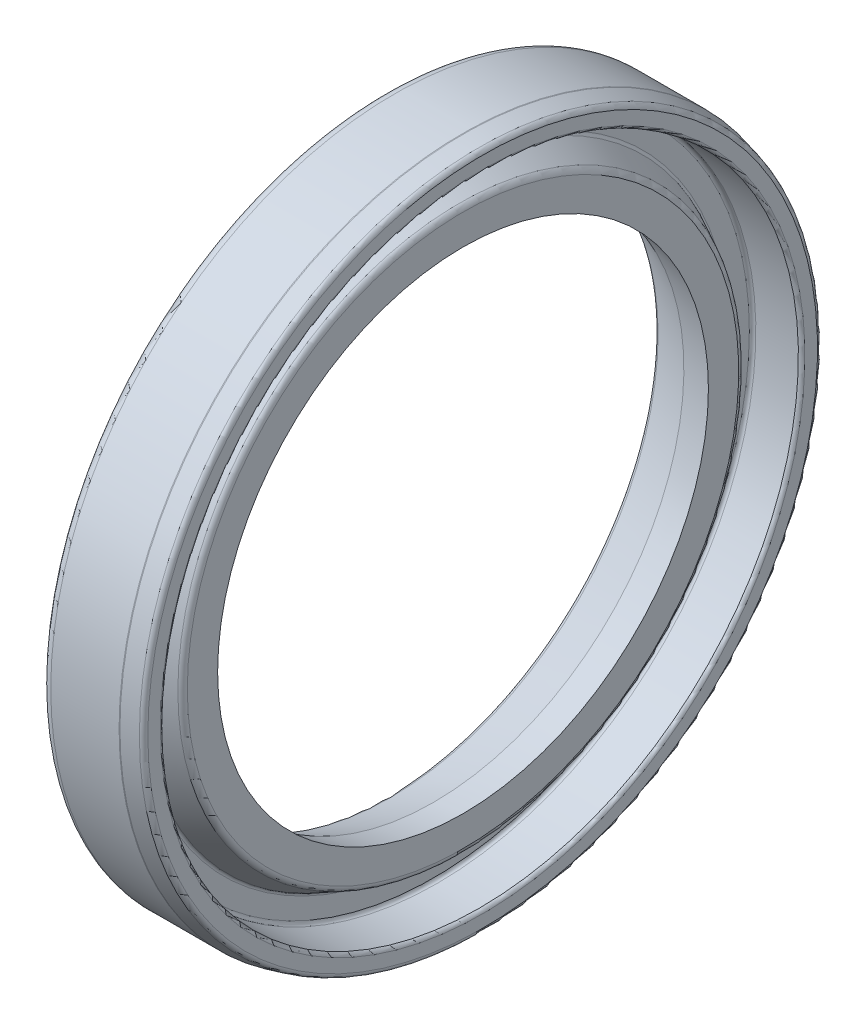
ISO-10303-21;
HEADER;
FILE_DESCRIPTION(('STEP AP214'),'2;1');
FILE_NAME('part.step','',(''),(''),'','','');
FILE_SCHEMA(('AUTOMOTIVE_DESIGN { 1 0 10303 214 1 1 1 1 }'));
ENDSEC;
DATA;
#1=APPLICATION_CONTEXT('core data for automotive mechanical design processes');
#2=APPLICATION_PROTOCOL_DEFINITION('international standard','automotive_design',2000,#1);
#3=PRODUCT_CONTEXT('',#1,'mechanical');
#4=PRODUCT('Part','Part','',(#3));
#5=PRODUCT_RELATED_PRODUCT_CATEGORY('part','',(#4));
#6=PRODUCT_DEFINITION_FORMATION('','',#4);
#7=PRODUCT_DEFINITION_CONTEXT('part definition',#1,'design');
#8=PRODUCT_DEFINITION('design','',#6,#7);
#9=PRODUCT_DEFINITION_SHAPE('','',#8);
#10=(LENGTH_UNIT() NAMED_UNIT(*) SI_UNIT(.MILLI.,.METRE.));
#11=(NAMED_UNIT(*) PLANE_ANGLE_UNIT() SI_UNIT($,.RADIAN.));
#12=(NAMED_UNIT(*) SI_UNIT($,.STERADIAN.) SOLID_ANGLE_UNIT());
#13=UNCERTAINTY_MEASURE_WITH_UNIT(LENGTH_MEASURE(1.E-05),#10,'distance_accuracy_value','');
#14=(GEOMETRIC_REPRESENTATION_CONTEXT(3) GLOBAL_UNCERTAINTY_ASSIGNED_CONTEXT((#13)) GLOBAL_UNIT_ASSIGNED_CONTEXT((#10,
#11,#12)) REPRESENTATION_CONTEXT('',''));
#15=CARTESIAN_POINT('',(0.,0.,0.));
#16=DIRECTION('',(0.,0.,1.));
#17=DIRECTION('',(1.,0.,0.));
#18=AXIS2_PLACEMENT_3D('',#15,#16,#17);
#19=CARTESIAN_POINT('',(0.,10.2,0.));
#20=DIRECTION('',(-1.,0.,0.));
#21=DIRECTION('',(0.,0.,1.));
#22=AXIS2_PLACEMENT_3D('',#19,#20,#21);
#23=PLANE('',#22);
#24=CARTESIAN_POINT('',(0.,0.,0.));
#25=DIRECTION('',(1.,0.,0.));
#26=DIRECTION('',(0.,0.,-1.));
#27=AXIS2_PLACEMENT_3D('',#24,#25,#26);
#28=CIRCLE('',#27,8.4531098884281);
#29=CARTESIAN_POINT('',(0.,0.,8.4531098884281));
#30=VERTEX_POINT('',#29);
#31=EDGE_CURVE('E28',#30,#30,#28,.T.);
#32=ORIENTED_EDGE('',*,*,#31,.T.);
#33=EDGE_LOOP('',(#32));
#34=FACE_BOUND('',#33,.T.);
#35=CARTESIAN_POINT('',(0.,0.,0.));
#36=DIRECTION('',(1.,0.,0.));
#37=DIRECTION('',(0.,0.,-1.));
#38=AXIS2_PLACEMENT_3D('',#35,#36,#37);
#39=CIRCLE('',#38,10.2);
#40=CARTESIAN_POINT('',(0.,0.,10.2));
#41=VERTEX_POINT('',#40);
#42=EDGE_CURVE('E208',#41,#41,#39,.T.);
#43=ORIENTED_EDGE('',*,*,#42,.F.);
#44=EDGE_LOOP('',(#43));
#45=FACE_BOUND('',#44,.T.);
#46=ADVANCED_FACE('F17',(#34,#45),#23,.T.);
#47=CARTESIAN_POINT('',(0.299999999999938,0.,0.));
#48=DIRECTION('',(1.,0.,0.));
#49=DIRECTION('',(0.,0.,-1.));
#50=AXIS2_PLACEMENT_3D('',#47,#48,#49);
#51=TOROIDAL_SURFACE('',#50,8.45310988842804,0.299999999999938);
#52=ORIENTED_EDGE('',*,*,#31,.F.);
#53=CARTESIAN_POINT('',(0.299999999999938,0.,8.45310988842804));
#54=DIRECTION('',(0.,-1.,0.));
#55=DIRECTION('',(0.,0.,1.));
#56=AXIS2_PLACEMENT_3D('',#53,#54,#55);
#57=CIRCLE('',#56,0.299999999999938);
#58=CARTESIAN_POINT('',(0.18858279709377,0.,8.1745668811625));
#59=VERTEX_POINT('',#58);
#60=EDGE_CURVE('E11',#30,#59,#57,.T.);
#61=ORIENTED_EDGE('',*,*,#60,.T.);
#62=CARTESIAN_POINT('',(0.18858279709377,0.,0.));
#63=DIRECTION('',(1.,0.,0.));
#64=DIRECTION('',(0.,0.,-1.));
#65=AXIS2_PLACEMENT_3D('',#62,#63,#64);
#66=CIRCLE('',#65,8.1745668811625);
#67=CARTESIAN_POINT('',(0.18858279709377,-8.1745668811625,0.));
#68=VERTEX_POINT('',#67);
#69=EDGE_CURVE('E218',#59,#68,#66,.T.);
#70=ORIENTED_EDGE('',*,*,#69,.T.);
#71=CARTESIAN_POINT('',(0.18858279709377,0.,0.));
#72=DIRECTION('',(1.,0.,0.));
#73=DIRECTION('',(0.,0.,-1.));
#74=AXIS2_PLACEMENT_3D('',#71,#72,#73);
#75=CIRCLE('',#74,8.1745668811625);
#76=EDGE_CURVE('E162',#68,#59,#75,.T.);
#77=ORIENTED_EDGE('',*,*,#76,.T.);
#78=ORIENTED_EDGE('',*,*,#60,.F.);
#79=EDGE_LOOP('',(#52,#61,#70,#77,#78));
#80=FACE_BOUND('',#79,.T.);
#81=ADVANCED_FACE('F334',(#80),#51,.T.);
#82=CARTESIAN_POINT('',(0.844291398546885,0.,0.));
#83=DIRECTION('',(-1.,0.,0.));
#84=DIRECTION('',(0.,1.,0.));
#85=AXIS2_PLACEMENT_3D('',#82,#83,#84);
#86=CONICAL_SURFACE('',#85,7.91228344058125,0.38050637711237);
#87=CARTESIAN_POINT('',(1.5,0.,0.));
#88=DIRECTION('',(1.,0.,0.));
#89=DIRECTION('',(0.,0.,-1.));
#90=AXIS2_PLACEMENT_3D('',#87,#88,#89);
#91=CIRCLE('',#90,7.65);
#92=CARTESIAN_POINT('',(1.5,-7.65,0.));
#93=VERTEX_POINT('',#92);
#94=EDGE_CURVE('E228',#93,#93,#91,.T.);
#95=ORIENTED_EDGE('',*,*,#94,.T.);
#96=DIRECTION('',(-0.928476690885258,-0.371390676354108,0.));
#97=VECTOR('',#96,1.);
#98=CARTESIAN_POINT('',(0.844291398546885,-7.91228344058125,0.));
#99=LINE('',#98,#97);
#100=EDGE_CURVE('E235',#93,#68,#99,.T.);
#101=ORIENTED_EDGE('',*,*,#100,.T.);
#102=ORIENTED_EDGE('',*,*,#69,.F.);
#103=ORIENTED_EDGE('',*,*,#76,.F.);
#104=ORIENTED_EDGE('',*,*,#100,.F.);
#105=EDGE_LOOP('',(#95,#101,#102,#103,#104));
#106=FACE_BOUND('',#105,.T.);
#107=ADVANCED_FACE('F342',(#106),#86,.F.);
#108=CARTESIAN_POINT('',(1.95,0.,0.));
#109=DIRECTION('',(-1.,0.,0.));
#110=DIRECTION('',(0.,1.,0.));
#111=AXIS2_PLACEMENT_3D('',#108,#109,#110);
#112=CONICAL_SURFACE('',#111,7.575,0.165148677414628);
#113=CARTESIAN_POINT('',(2.4,0.,0.));
#114=DIRECTION('',(1.,0.,0.));
#115=DIRECTION('',(0.,0.,-1.));
#116=AXIS2_PLACEMENT_3D('',#113,#114,#115);
#117=CIRCLE('',#116,7.5);
#118=CARTESIAN_POINT('',(2.4,-7.5,0.));
#119=VERTEX_POINT('',#118);
#120=EDGE_CURVE('E134',#119,#119,#117,.T.);
#121=ORIENTED_EDGE('',*,*,#120,.T.);
#122=DIRECTION('',(-0.986393923832143,-0.164398987305359,0.));
#123=VECTOR('',#122,1.);
#124=CARTESIAN_POINT('',(1.95,-7.575,0.));
#125=LINE('',#124,#123);
#126=EDGE_CURVE('E221',#119,#93,#125,.T.);
#127=ORIENTED_EDGE('',*,*,#126,.T.);
#128=ORIENTED_EDGE('',*,*,#94,.F.);
#129=ORIENTED_EDGE('',*,*,#126,.F.);
#130=EDGE_LOOP('',(#121,#127,#128,#129));
#131=FACE_BOUND('',#130,.T.);
#132=ADVANCED_FACE('F362',(#131),#112,.F.);
#133=CARTESIAN_POINT('',(2.4,7.5,0.));
#134=DIRECTION('',(1.,0.,0.));
#135=DIRECTION('',(0.,1.,0.));
#136=AXIS2_PLACEMENT_3D('',#133,#134,#135);
#137=PLANE('',#136);
#138=ORIENTED_EDGE('',*,*,#120,.F.);
#139=EDGE_LOOP('',(#138));
#140=FACE_BOUND('',#139,.T.);
#141=CARTESIAN_POINT('',(2.4,0.,0.));
#142=DIRECTION('',(1.,0.,0.));
#143=DIRECTION('',(0.,0.,-1.));
#144=AXIS2_PLACEMENT_3D('',#141,#142,#143);
#145=CIRCLE('',#144,8.42639320225);
#146=CARTESIAN_POINT('',(2.4,0.,8.42639320225));
#147=VERTEX_POINT('',#146);
#148=EDGE_CURVE('E21',#147,#147,#145,.T.);
#149=ORIENTED_EDGE('',*,*,#148,.T.);
#150=EDGE_LOOP('',(#149));
#151=FACE_BOUND('',#150,.T.);
#152=ADVANCED_FACE('F137',(#140,#151),#137,.T.);
#153=CARTESIAN_POINT('',(2.19999999999982,0.,0.));
#154=DIRECTION('',(1.,0.,0.));
#155=DIRECTION('',(0.,0.,-1.));
#156=AXIS2_PLACEMENT_3D('',#153,#154,#155);
#157=TOROIDAL_SURFACE('',#156,8.42639320224991,0.200000000000184);
#158=ORIENTED_EDGE('',*,*,#148,.F.);
#159=CARTESIAN_POINT('',(2.19999999999982,0.,8.42639320224991));
#160=DIRECTION('',(0.,-1.,0.));
#161=DIRECTION('',(0.,0.,1.));
#162=AXIS2_PLACEMENT_3D('',#159,#160,#161);
#163=CIRCLE('',#162,0.200000000000184);
#164=CARTESIAN_POINT('',(2.2894427191,0.,8.60527864045));
#165=VERTEX_POINT('',#164);
#166=EDGE_CURVE('E127',#147,#165,#163,.T.);
#167=ORIENTED_EDGE('',*,*,#166,.T.);
#168=CARTESIAN_POINT('',(2.2894427191,0.,0.));
#169=DIRECTION('',(1.,0.,0.));
#170=DIRECTION('',(0.,0.,-1.));
#171=AXIS2_PLACEMENT_3D('',#168,#169,#170);
#172=CIRCLE('',#171,8.60527864045);
#173=CARTESIAN_POINT('',(2.2894427191,-8.60527864045,0.));
#174=VERTEX_POINT('',#173);
#175=EDGE_CURVE('E139',#165,#174,#172,.T.);
#176=ORIENTED_EDGE('',*,*,#175,.T.);
#177=CARTESIAN_POINT('',(2.2894427191,0.,0.));
#178=DIRECTION('',(1.,0.,0.));
#179=DIRECTION('',(0.,0.,-1.));
#180=AXIS2_PLACEMENT_3D('',#177,#178,#179);
#181=CIRCLE('',#180,8.60527864045);
#182=EDGE_CURVE('E131',#174,#165,#181,.T.);
#183=ORIENTED_EDGE('',*,*,#182,.T.);
#184=ORIENTED_EDGE('',*,*,#166,.F.);
#185=EDGE_LOOP('',(#158,#167,#176,#183,#184));
#186=FACE_BOUND('',#185,.T.);
#187=ADVANCED_FACE('F129',(#186),#157,.T.);
#188=CARTESIAN_POINT('',(1.922360679775,0.,0.));
#189=DIRECTION('',(-1.,0.,0.));
#190=DIRECTION('',(0.,1.,0.));
#191=AXIS2_PLACEMENT_3D('',#188,#189,#190);
#192=CONICAL_SURFACE('',#191,8.7888196601125,0.463647609000806);
#193=ORIENTED_EDGE('',*,*,#182,.F.);
#194=DIRECTION('',(-0.894427190999916,-0.447213595499958,0.));
#195=VECTOR('',#194,1.);
#196=CARTESIAN_POINT('',(1.922360679775,-8.7888196601125,0.));
#197=LINE('',#196,#195);
#198=CARTESIAN_POINT('',(1.55527864045,-8.972360679775,0.));
#199=VERTEX_POINT('',#198);
#200=EDGE_CURVE('E144',#174,#199,#197,.T.);
#201=ORIENTED_EDGE('',*,*,#200,.T.);
#202=CARTESIAN_POINT('',(1.55527864045,0.,0.));
#203=DIRECTION('',(1.,0.,0.));
#204=DIRECTION('',(0.,0.,-1.));
#205=AXIS2_PLACEMENT_3D('',#202,#203,#204);
#206=CIRCLE('',#205,8.972360679775);
#207=CARTESIAN_POINT('',(1.55527864045,0.,8.972360679775));
#208=VERTEX_POINT('',#207);
#209=EDGE_CURVE('E215',#199,#208,#206,.T.);
#210=ORIENTED_EDGE('',*,*,#209,.T.);
#211=CARTESIAN_POINT('',(1.55527864045,0.,0.));
#212=DIRECTION('',(1.,0.,0.));
#213=DIRECTION('',(0.,0.,-1.));
#214=AXIS2_PLACEMENT_3D('',#211,#212,#213);
#215=CIRCLE('',#214,8.972360679775);
#216=EDGE_CURVE('E153',#208,#199,#215,.T.);
#217=ORIENTED_EDGE('',*,*,#216,.T.);
#218=ORIENTED_EDGE('',*,*,#200,.F.);
#219=ORIENTED_EDGE('',*,*,#175,.F.);
#220=EDGE_LOOP('',(#193,#201,#210,#217,#218,#219));
#221=FACE_BOUND('',#220,.T.);
#222=ADVANCED_FACE('F309',(#221),#192,.T.);
#223=CARTESIAN_POINT('',(1.60000000000009,0.,0.));
#224=DIRECTION('',(1.,0.,0.));
#225=DIRECTION('',(0.,0.,-1.));
#226=AXIS2_PLACEMENT_3D('',#223,#224,#225);
#227=TOROIDAL_SURFACE('',#226,9.06180339887504,0.100000000000084);
#228=CARTESIAN_POINT('',(1.5,0.,0.));
#229=DIRECTION('',(1.,0.,0.));
#230=DIRECTION('',(0.,0.,-1.));
#231=AXIS2_PLACEMENT_3D('',#228,#229,#230);
#232=CIRCLE('',#231,9.061803398875);
#233=CARTESIAN_POINT('',(1.5,0.,9.061803398875));
#234=VERTEX_POINT('',#233);
#235=EDGE_CURVE('E169',#234,#234,#232,.T.);
#236=ORIENTED_EDGE('',*,*,#235,.T.);
#237=CARTESIAN_POINT('',(1.60000000000009,0.,9.06180339887504));
#238=DIRECTION('',(0.,-1.,0.));
#239=DIRECTION('',(0.,0.,1.));
#240=AXIS2_PLACEMENT_3D('',#237,#238,#239);
#241=CIRCLE('',#240,0.100000000000084);
#242=EDGE_CURVE('E173',#234,#208,#241,.T.);
#243=ORIENTED_EDGE('',*,*,#242,.T.);
#244=ORIENTED_EDGE('',*,*,#209,.F.);
#245=ORIENTED_EDGE('',*,*,#216,.F.);
#246=ORIENTED_EDGE('',*,*,#242,.F.);
#247=EDGE_LOOP('',(#236,#243,#244,#245,#246));
#248=FACE_BOUND('',#247,.T.);
#249=ADVANCED_FACE('F312',(#248),#227,.F.);
#250=CARTESIAN_POINT('',(1.5,9.061803398875,0.));
#251=DIRECTION('',(1.,0.,0.));
#252=DIRECTION('',(0.,1.,0.));
#253=AXIS2_PLACEMENT_3D('',#250,#251,#252);
#254=PLANE('',#253);
#255=ORIENTED_EDGE('',*,*,#235,.F.);
#256=EDGE_LOOP('',(#255));
#257=FACE_BOUND('',#256,.T.);
#258=CARTESIAN_POINT('',(1.5,0.,0.));
#259=DIRECTION('',(1.,0.,0.));
#260=DIRECTION('',(0.,0.,-1.));
#261=AXIS2_PLACEMENT_3D('',#258,#259,#260);
#262=CIRCLE('',#261,9.65);
#263=CARTESIAN_POINT('',(1.5,0.,9.65));
#264=VERTEX_POINT('',#263);
#265=EDGE_CURVE('E167',#264,#264,#262,.T.);
#266=ORIENTED_EDGE('',*,*,#265,.T.);
#267=EDGE_LOOP('',(#266));
#268=FACE_BOUND('',#267,.T.);
#269=ADVANCED_FACE('F348',(#257,#268),#254,.T.);
#270=CARTESIAN_POINT('',(1.59999999999985,0.,0.));
#271=DIRECTION('',(1.,0.,0.));
#272=DIRECTION('',(0.,0.,-1.));
#273=AXIS2_PLACEMENT_3D('',#270,#271,#272);
#274=TOROIDAL_SURFACE('',#273,9.65000000000015,0.099999999999846);
#275=CARTESIAN_POINT('',(1.6,0.,0.));
#276=DIRECTION('',(1.,0.,0.));
#277=DIRECTION('',(0.,0.,-1.));
#278=AXIS2_PLACEMENT_3D('',#275,#276,#277);
#279=CIRCLE('',#278,9.75);
#280=CARTESIAN_POINT('',(1.6,-9.75,0.));
#281=VERTEX_POINT('',#280);
#282=CARTESIAN_POINT('',(1.6,0.,9.75));
#283=VERTEX_POINT('',#282);
#284=EDGE_CURVE('E168',#281,#283,#279,.T.);
#285=ORIENTED_EDGE('',*,*,#284,.T.);
#286=CARTESIAN_POINT('',(1.59999999999985,0.,9.65000000000015));
#287=DIRECTION('',(0.,-1.,0.));
#288=DIRECTION('',(0.,0.,1.));
#289=AXIS2_PLACEMENT_3D('',#286,#287,#288);
#290=CIRCLE('',#289,0.099999999999846);
#291=EDGE_CURVE('E163',#283,#264,#290,.T.);
#292=ORIENTED_EDGE('',*,*,#291,.T.);
#293=ORIENTED_EDGE('',*,*,#265,.F.);
#294=ORIENTED_EDGE('',*,*,#291,.F.);
#295=CARTESIAN_POINT('',(1.6,0.,0.));
#296=DIRECTION('',(1.,0.,0.));
#297=DIRECTION('',(0.,0.,-1.));
#298=AXIS2_PLACEMENT_3D('',#295,#296,#297);
#299=CIRCLE('',#298,9.75);
#300=EDGE_CURVE('E194',#283,#281,#299,.T.);
#301=ORIENTED_EDGE('',*,*,#300,.T.);
#302=EDGE_LOOP('',(#285,#292,#293,#294,#301));
#303=FACE_BOUND('',#302,.T.);
#304=ADVANCED_FACE('F346',(#303),#274,.F.);
#305=CARTESIAN_POINT('',(2.25,0.,0.));
#306=DIRECTION('',(1.,0.,0.));
#307=DIRECTION('',(0.,1.,0.));
#308=AXIS2_PLACEMENT_3D('',#305,#306,#307);
#309=CYLINDRICAL_SURFACE('',#308,9.75);
#310=CARTESIAN_POINT('',(2.9,0.,0.));
#311=DIRECTION('',(1.,0.,0.));
#312=DIRECTION('',(0.,0.,-1.));
#313=AXIS2_PLACEMENT_3D('',#310,#311,#312);
#314=CIRCLE('',#313,9.75);
#315=CARTESIAN_POINT('',(2.9,-9.75,0.));
#316=VERTEX_POINT('',#315);
#317=CARTESIAN_POINT('',(2.9,0.,9.75));
#318=VERTEX_POINT('',#317);
#319=EDGE_CURVE('E178',#316,#318,#314,.T.);
#320=ORIENTED_EDGE('',*,*,#319,.T.);
#321=CARTESIAN_POINT('',(2.9,0.,0.));
#322=DIRECTION('',(1.,0.,0.));
#323=DIRECTION('',(0.,0.,-1.));
#324=AXIS2_PLACEMENT_3D('',#321,#322,#323);
#325=CIRCLE('',#324,9.75);
#326=EDGE_CURVE('E186',#318,#316,#325,.T.);
#327=ORIENTED_EDGE('',*,*,#326,.T.);
#328=DIRECTION('',(-1.,0.,0.));
#329=VECTOR('',#328,1.);
#330=CARTESIAN_POINT('',(2.25,-9.75,0.));
#331=LINE('',#330,#329);
#332=EDGE_CURVE('E185',#316,#281,#331,.T.);
#333=ORIENTED_EDGE('',*,*,#332,.T.);
#334=ORIENTED_EDGE('',*,*,#300,.F.);
#335=ORIENTED_EDGE('',*,*,#284,.F.);
#336=ORIENTED_EDGE('',*,*,#332,.F.);
#337=EDGE_LOOP('',(#320,#327,#333,#334,#335,#336));
#338=FACE_BOUND('',#337,.T.);
#339=ADVANCED_FACE('F404',(#338),#309,.F.);
#340=CARTESIAN_POINT('',(2.90000000000015,0.,0.));
#341=DIRECTION('',(1.,0.,0.));
#342=DIRECTION('',(0.,0.,-1.));
#343=AXIS2_PLACEMENT_3D('',#340,#341,#342);
#344=TOROIDAL_SURFACE('',#343,9.84999999999985,0.0999999999998469);
#345=ORIENTED_EDGE('',*,*,#319,.F.);
#346=ORIENTED_EDGE('',*,*,#326,.F.);
#347=CARTESIAN_POINT('',(2.90000000000015,0.,9.84999999999985));
#348=DIRECTION('',(0.,-1.,0.));
#349=DIRECTION('',(0.,0.,1.));
#350=AXIS2_PLACEMENT_3D('',#347,#348,#349);
#351=CIRCLE('',#350,0.0999999999998469);
#352=CARTESIAN_POINT('',(3.,0.,9.85));
#353=VERTEX_POINT('',#352);
#354=EDGE_CURVE('E183',#318,#353,#351,.T.);
#355=ORIENTED_EDGE('',*,*,#354,.T.);
#356=CARTESIAN_POINT('',(3.,0.,0.));
#357=DIRECTION('',(1.,0.,0.));
#358=DIRECTION('',(0.,0.,-1.));
#359=AXIS2_PLACEMENT_3D('',#356,#357,#358);
#360=CIRCLE('',#359,9.85);
#361=EDGE_CURVE('E174',#353,#353,#360,.T.);
#362=ORIENTED_EDGE('',*,*,#361,.T.);
#363=ORIENTED_EDGE('',*,*,#354,.F.);
#364=EDGE_LOOP('',(#345,#346,#355,#362,#363));
#365=FACE_BOUND('',#364,.T.);
#366=ADVANCED_FACE('F358',(#365),#344,.T.);
#367=CARTESIAN_POINT('',(3.,9.85,0.));
#368=DIRECTION('',(1.,0.,0.));
#369=DIRECTION('',(0.,1.,0.));
#370=AXIS2_PLACEMENT_3D('',#367,#368,#369);
#371=PLANE('',#370);
#372=ORIENTED_EDGE('',*,*,#361,.F.);
#373=EDGE_LOOP('',(#372));
#374=FACE_BOUND('',#373,.T.);
#375=CARTESIAN_POINT('',(3.,0.,0.));
#376=DIRECTION('',(1.,0.,0.));
#377=DIRECTION('',(0.,0.,-1.));
#378=AXIS2_PLACEMENT_3D('',#375,#376,#377);
#379=CIRCLE('',#378,10.232883539039);
#380=CARTESIAN_POINT('',(3.,0.,10.232883539039));
#381=VERTEX_POINT('',#380);
#382=EDGE_CURVE('E281',#381,#381,#379,.T.);
#383=ORIENTED_EDGE('',*,*,#382,.T.);
#384=EDGE_LOOP('',(#383));
#385=FACE_BOUND('',#384,.T.);
#386=ADVANCED_FACE('F354',(#374,#385),#371,.T.);
#387=CARTESIAN_POINT('',(2.8500000000009,0.,0.));
#388=DIRECTION('',(1.,0.,0.));
#389=DIRECTION('',(0.,0.,-1.));
#390=AXIS2_PLACEMENT_3D('',#387,#388,#389);
#391=TOROIDAL_SURFACE('',#390,10.2328835390399,0.149999999999096);
#392=ORIENTED_EDGE('',*,*,#382,.F.);
#393=CARTESIAN_POINT('',(2.8500000000009,0.,10.2328835390399));
#394=DIRECTION('',(0.,-1.,0.));
#395=DIRECTION('',(0.,0.,1.));
#396=AXIS2_PLACEMENT_3D('',#393,#394,#395);
#397=CIRCLE('',#396,0.149999999999096);
#398=CARTESIAN_POINT('',(2.8863803437554,0.,10.378404914061));
#399=VERTEX_POINT('',#398);
#400=EDGE_CURVE('E179',#381,#399,#397,.T.);
#401=ORIENTED_EDGE('',*,*,#400,.T.);
#402=CARTESIAN_POINT('',(2.8863803437554,0.,0.));
#403=DIRECTION('',(1.,0.,0.));
#404=DIRECTION('',(0.,0.,-1.));
#405=AXIS2_PLACEMENT_3D('',#402,#403,#404);
#406=CIRCLE('',#405,10.378404914061);
#407=CARTESIAN_POINT('',(2.8863803437554,-10.378404914061,0.));
#408=VERTEX_POINT('',#407);
#409=EDGE_CURVE('E272',#399,#408,#406,.T.);
#410=ORIENTED_EDGE('',*,*,#409,.T.);
#411=CARTESIAN_POINT('',(2.8863803437554,0.,0.));
#412=DIRECTION('',(1.,0.,0.));
#413=DIRECTION('',(0.,0.,-1.));
#414=AXIS2_PLACEMENT_3D('',#411,#412,#413);
#415=CIRCLE('',#414,10.378404914061);
#416=EDGE_CURVE('E254',#408,#399,#415,.T.);
#417=ORIENTED_EDGE('',*,*,#416,.T.);
#418=ORIENTED_EDGE('',*,*,#400,.F.);
#419=EDGE_LOOP('',(#392,#401,#410,#417,#418));
#420=FACE_BOUND('',#419,.T.);
#421=ADVANCED_FACE('F357',(#420),#391,.T.);
#422=CARTESIAN_POINT('',(2.64916167184865,0.,0.));
#423=DIRECTION('',(-1.,0.,0.));
#424=DIRECTION('',(0.,1.,0.));
#425=AXIS2_PLACEMENT_3D('',#422,#423,#424);
#426=CONICAL_SURFACE('',#425,10.437709582038,0.244978663128106);
#427=ORIENTED_EDGE('',*,*,#416,.F.);
#428=DIRECTION('',(-0.970142500145031,-0.242535625037537,0.));
#429=VECTOR('',#428,1.);
#430=CARTESIAN_POINT('',(2.64916167184865,-10.437709582038,0.));
#431=LINE('',#430,#429);
#432=CARTESIAN_POINT('',(2.4119429999419,-10.497014250015,0.));
#433=VERTEX_POINT('',#432);
#434=EDGE_CURVE('E264',#408,#433,#431,.T.);
#435=ORIENTED_EDGE('',*,*,#434,.T.);
#436=CARTESIAN_POINT('',(2.4119429999419,0.,0.));
#437=DIRECTION('',(1.,0.,0.));
#438=DIRECTION('',(0.,0.,-1.));
#439=AXIS2_PLACEMENT_3D('',#436,#437,#438);
#440=CIRCLE('',#439,10.497014250015);
#441=CARTESIAN_POINT('',(2.4119429999419,0.,10.497014250015));
#442=VERTEX_POINT('',#441);
#443=EDGE_CURVE('E241',#433,#442,#440,.T.);
#444=ORIENTED_EDGE('',*,*,#443,.T.);
#445=CARTESIAN_POINT('',(2.4119429999419,0.,0.));
#446=DIRECTION('',(1.,0.,0.));
#447=DIRECTION('',(0.,0.,-1.));
#448=AXIS2_PLACEMENT_3D('',#445,#446,#447);
#449=CIRCLE('',#448,10.497014250015);
#450=EDGE_CURVE('E255',#442,#433,#449,.T.);
#451=ORIENTED_EDGE('',*,*,#450,.T.);
#452=ORIENTED_EDGE('',*,*,#434,.F.);
#453=ORIENTED_EDGE('',*,*,#409,.F.);
#454=EDGE_LOOP('',(#427,#435,#444,#451,#452,#453));
#455=FACE_BOUND('',#454,.T.);
#456=ADVANCED_FACE('F19',(#455),#426,.T.);
#457=CARTESIAN_POINT('',(2.38768943743161,0.,0.));
#458=DIRECTION('',(1.,0.,0.));
#459=DIRECTION('',(0.,0.,-1.));
#460=AXIS2_PLACEMENT_3D('',#457,#458,#459);
#461=TOROIDAL_SURFACE('',#460,10.3999999999307,0.100000000069256);
#462=ORIENTED_EDGE('',*,*,#443,.F.);
#463=ORIENTED_EDGE('',*,*,#450,.F.);
#464=CARTESIAN_POINT('',(2.38768943743161,0.,10.3999999999307));
#465=DIRECTION('',(0.,-1.,0.));
#466=DIRECTION('',(0.,0.,1.));
#467=AXIS2_PLACEMENT_3D('',#464,#465,#466);
#468=CIRCLE('',#467,0.100000000069256);
#469=CARTESIAN_POINT('',(2.3876894374382,0.,10.5));
#470=VERTEX_POINT('',#469);
#471=EDGE_CURVE('E251',#442,#470,#468,.T.);
#472=ORIENTED_EDGE('',*,*,#471,.T.);
#473=CARTESIAN_POINT('',(2.3876894374382,0.,0.));
#474=DIRECTION('',(1.,0.,0.));
#475=DIRECTION('',(0.,0.,-1.));
#476=AXIS2_PLACEMENT_3D('',#473,#474,#475);
#477=CIRCLE('',#476,10.5);
#478=CARTESIAN_POINT('',(2.3876894374382,-10.5,0.));
#479=VERTEX_POINT('',#478);
#480=EDGE_CURVE('E238',#470,#479,#477,.T.);
#481=ORIENTED_EDGE('',*,*,#480,.T.);
#482=CARTESIAN_POINT('',(2.3876894374382,0.,0.));
#483=DIRECTION('',(1.,0.,0.));
#484=DIRECTION('',(0.,0.,-1.));
#485=AXIS2_PLACEMENT_3D('',#482,#483,#484);
#486=CIRCLE('',#485,10.5);
#487=EDGE_CURVE('E212',#479,#470,#486,.T.);
#488=ORIENTED_EDGE('',*,*,#487,.T.);
#489=ORIENTED_EDGE('',*,*,#471,.F.);
#490=EDGE_LOOP('',(#462,#463,#472,#481,#488,#489));
#491=FACE_BOUND('',#490,.T.);
#492=ADVANCED_FACE('F436',(#491),#461,.T.);
#493=CARTESIAN_POINT('',(1.3438447187191,0.,0.));
#494=DIRECTION('',(1.,0.,0.));
#495=DIRECTION('',(0.,1.,0.));
#496=AXIS2_PLACEMENT_3D('',#493,#494,#495);
#497=CYLINDRICAL_SURFACE('',#496,10.5);
#498=ORIENTED_EDGE('',*,*,#487,.F.);
#499=DIRECTION('',(-1.,0.,0.));
#500=VECTOR('',#499,1.);
#501=CARTESIAN_POINT('',(1.3438447187191,-10.5,0.));
#502=LINE('',#501,#500);
#503=CARTESIAN_POINT('',(0.3,-10.5,0.));
#504=VERTEX_POINT('',#503);
#505=EDGE_CURVE('E242',#479,#504,#502,.T.);
#506=ORIENTED_EDGE('',*,*,#505,.T.);
#507=CARTESIAN_POINT('',(0.3,0.,0.));
#508=DIRECTION('',(1.,0.,0.));
#509=DIRECTION('',(0.,0.,-1.));
#510=AXIS2_PLACEMENT_3D('',#507,#508,#509);
#511=CIRCLE('',#510,10.5);
#512=CARTESIAN_POINT('',(0.3,0.,10.5));
#513=VERTEX_POINT('',#512);
#514=EDGE_CURVE('E155',#504,#513,#511,.T.);
#515=ORIENTED_EDGE('',*,*,#514,.T.);
#516=CARTESIAN_POINT('',(0.3,0.,0.));
#517=DIRECTION('',(1.,0.,0.));
#518=DIRECTION('',(0.,0.,-1.));
#519=AXIS2_PLACEMENT_3D('',#516,#517,#518);
#520=CIRCLE('',#519,10.5);
#521=EDGE_CURVE('E159',#513,#504,#520,.T.);
#522=ORIENTED_EDGE('',*,*,#521,.T.);
#523=ORIENTED_EDGE('',*,*,#505,.F.);
#524=ORIENTED_EDGE('',*,*,#480,.F.);
#525=EDGE_LOOP('',(#498,#506,#515,#522,#523,#524));
#526=FACE_BOUND('',#525,.T.);
#527=ADVANCED_FACE('F443',(#526),#497,.T.);
#528=CARTESIAN_POINT('',(0.299999999999938,0.,0.));
#529=DIRECTION('',(1.,0.,0.));
#530=DIRECTION('',(0.,0.,-1.));
#531=AXIS2_PLACEMENT_3D('',#528,#529,#530);
#532=TOROIDAL_SURFACE('',#531,10.2,0.299999999999938);
#533=ORIENTED_EDGE('',*,*,#514,.F.);
#534=ORIENTED_EDGE('',*,*,#521,.F.);
#535=CARTESIAN_POINT('',(0.299999999999938,0.,10.2));
#536=DIRECTION('',(0.,-1.,0.));
#537=DIRECTION('',(0.,0.,1.));
#538=AXIS2_PLACEMENT_3D('',#535,#536,#537);
#539=CIRCLE('',#538,0.299999999999938);
#540=EDGE_CURVE('E182',#513,#41,#539,.T.);
#541=ORIENTED_EDGE('',*,*,#540,.T.);
#542=ORIENTED_EDGE('',*,*,#42,.T.);
#543=ORIENTED_EDGE('',*,*,#540,.F.);
#544=EDGE_LOOP('',(#533,#534,#541,#542,#543));
#545=FACE_BOUND('',#544,.T.);
#546=ADVANCED_FACE('F330',(#545),#532,.T.);
#547=CLOSED_SHELL('',(#46,#81,#107,#132,#152,#187,#222,#249,#269,#304,#339,#366,#386,#421,#456,
#492,#527,#546));
#548=MANIFOLD_SOLID_BREP('B1',#547);
#549=ADVANCED_BREP_SHAPE_REPRESENTATION('',(#18,#548),#14);
#550=SHAPE_DEFINITION_REPRESENTATION(#9,#549);
ENDSEC;
END-ISO-10303-21;
